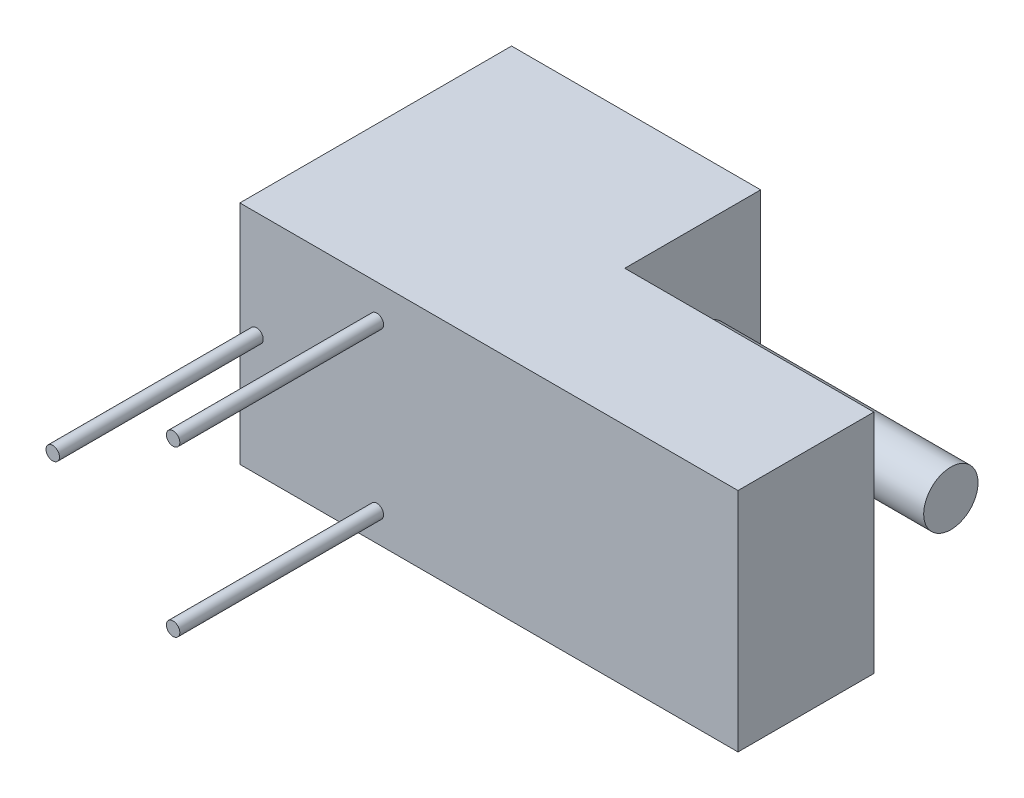
ISO-10303-21;
HEADER;
FILE_DESCRIPTION(('STEP AP214'),'2;1');
FILE_NAME('part.step','',(''),(''),'','','');
FILE_SCHEMA(('AUTOMOTIVE_DESIGN { 1 0 10303 214 1 1 1 1 }'));
ENDSEC;
DATA;
#1=APPLICATION_CONTEXT('core data for automotive mechanical design processes');
#2=APPLICATION_PROTOCOL_DEFINITION('international standard','automotive_design',2000,#1);
#3=PRODUCT_CONTEXT('',#1,'mechanical');
#4=PRODUCT('Part','Part','',(#3));
#5=PRODUCT_RELATED_PRODUCT_CATEGORY('part','',(#4));
#6=PRODUCT_DEFINITION_FORMATION('','',#4);
#7=PRODUCT_DEFINITION_CONTEXT('part definition',#1,'design');
#8=PRODUCT_DEFINITION('design','',#6,#7);
#9=PRODUCT_DEFINITION_SHAPE('','',#8);
#10=(LENGTH_UNIT() NAMED_UNIT(*) SI_UNIT(.MILLI.,.METRE.));
#11=(NAMED_UNIT(*) PLANE_ANGLE_UNIT() SI_UNIT($,.RADIAN.));
#12=(NAMED_UNIT(*) SI_UNIT($,.STERADIAN.) SOLID_ANGLE_UNIT());
#13=UNCERTAINTY_MEASURE_WITH_UNIT(LENGTH_MEASURE(1.E-05),#10,'distance_accuracy_value','');
#14=(GEOMETRIC_REPRESENTATION_CONTEXT(3) GLOBAL_UNCERTAINTY_ASSIGNED_CONTEXT((#13)) GLOBAL_UNIT_ASSIGNED_CONTEXT((#10,
#11,#12)) REPRESENTATION_CONTEXT('',''));
#15=CARTESIAN_POINT('',(0.,0.,0.));
#16=DIRECTION('',(0.,0.,1.));
#17=DIRECTION('',(1.,0.,0.));
#18=AXIS2_PLACEMENT_3D('',#15,#16,#17);
#19=CARTESIAN_POINT('',(-5.50000000000001,-2.5,6.));
#20=DIRECTION('',(0.,0.,1.));
#21=DIRECTION('',(1.,0.,0.));
#22=AXIS2_PLACEMENT_3D('',#19,#20,#21);
#23=PLANE('',#22);
#24=CARTESIAN_POINT('',(-2.47416944841838,1.757272293753,6.));
#25=DIRECTION('',(0.,0.,1.));
#26=DIRECTION('',(1.,0.,0.));
#27=AXIS2_PLACEMENT_3D('',#24,#25,#26);
#28=CIRCLE('',#27,0.148625019869675);
#29=CARTESIAN_POINT('',(-2.3255444285487,1.757272293753,6.));
#30=VERTEX_POINT('',#29);
#31=EDGE_CURVE('E147',#30,#30,#28,.T.);
#32=ORIENTED_EDGE('',*,*,#31,.F.);
#33=EDGE_LOOP('',(#32));
#34=FACE_BOUND('',#33,.T.);
#35=DIRECTION('',(0.,-1.,0.));
#36=VECTOR('',#35,1.);
#37=CARTESIAN_POINT('',(-5.49999999999998,2.5,6.));
#38=LINE('',#37,#36);
#39=CARTESIAN_POINT('',(-5.49999999999998,2.5,6.));
#40=VERTEX_POINT('',#39);
#41=CARTESIAN_POINT('',(-5.50000000000001,-2.5,6.));
#42=VERTEX_POINT('',#41);
#43=EDGE_CURVE('E122',#40,#42,#38,.T.);
#44=ORIENTED_EDGE('',*,*,#43,.T.);
#45=DIRECTION('',(1.,0.,0.));
#46=VECTOR('',#45,1.);
#47=CARTESIAN_POINT('',(-5.50000000000001,-2.5,6.));
#48=LINE('',#47,#46);
#49=CARTESIAN_POINT('',(5.5,-2.5,6.));
#50=VERTEX_POINT('',#49);
#51=EDGE_CURVE('E120',#42,#50,#48,.T.);
#52=ORIENTED_EDGE('',*,*,#51,.T.);
#53=DIRECTION('',(0.,1.,0.));
#54=VECTOR('',#53,1.);
#55=CARTESIAN_POINT('',(5.5,2.5,6.));
#56=LINE('',#55,#54);
#57=CARTESIAN_POINT('',(5.5,2.5,6.));
#58=VERTEX_POINT('',#57);
#59=EDGE_CURVE('E118',#50,#58,#56,.T.);
#60=ORIENTED_EDGE('',*,*,#59,.T.);
#61=DIRECTION('',(-1.,0.,0.));
#62=VECTOR('',#61,1.);
#63=CARTESIAN_POINT('',(-5.49999999999998,2.5,6.));
#64=LINE('',#63,#62);
#65=EDGE_CURVE('E54',#58,#40,#64,.T.);
#66=ORIENTED_EDGE('',*,*,#65,.T.);
#67=EDGE_LOOP('',(#44,#52,#60,#66));
#68=FACE_BOUND('',#67,.T.);
#69=CARTESIAN_POINT('',(-5.13193450961692,0.148625019869675,6.));
#70=DIRECTION('',(0.,0.,1.));
#71=DIRECTION('',(1.,0.,0.));
#72=AXIS2_PLACEMENT_3D('',#69,#70,#71);
#73=CIRCLE('',#72,0.148625019869675);
#74=CARTESIAN_POINT('',(-4.98330948974724,0.148625019869675,6.));
#75=VERTEX_POINT('',#74);
#76=EDGE_CURVE('E141',#75,#75,#73,.T.);
#77=ORIENTED_EDGE('',*,*,#76,.F.);
#78=EDGE_LOOP('',(#77));
#79=FACE_BOUND('',#78,.T.);
#80=CARTESIAN_POINT('',(-2.47416944841838,-1.87966936893974,6.));
#81=DIRECTION('',(0.,0.,1.));
#82=DIRECTION('',(1.,0.,0.));
#83=AXIS2_PLACEMENT_3D('',#80,#81,#82);
#84=CIRCLE('',#83,0.148625019869675);
#85=CARTESIAN_POINT('',(-2.3255444285487,-1.87966936893974,6.));
#86=VERTEX_POINT('',#85);
#87=EDGE_CURVE('E153',#86,#86,#84,.T.);
#88=ORIENTED_EDGE('',*,*,#87,.F.);
#89=EDGE_LOOP('',(#88));
#90=FACE_BOUND('',#89,.T.);
#91=ADVANCED_FACE('F31',(#34,#68,#79,#90),#23,.T.);
#92=CARTESIAN_POINT('',(0.,2.5,3.));
#93=DIRECTION('',(-1.,0.,0.));
#94=DIRECTION('',(0.,-1.,0.));
#95=AXIS2_PLACEMENT_3D('',#92,#93,#94);
#96=PLANE('',#95);
#97=DIRECTION('',(0.,0.,1.));
#98=VECTOR('',#97,1.);
#99=CARTESIAN_POINT('',(0.,-2.5,6.));
#100=LINE('',#99,#98);
#101=CARTESIAN_POINT('',(0.,-2.5,0.));
#102=VERTEX_POINT('',#101);
#103=CARTESIAN_POINT('',(0.,-2.5,3.));
#104=VERTEX_POINT('',#103);
#105=EDGE_CURVE('E46',#102,#104,#100,.T.);
#106=ORIENTED_EDGE('',*,*,#105,.F.);
#107=DIRECTION('',(0.,-1.,0.));
#108=VECTOR('',#107,1.);
#109=CARTESIAN_POINT('',(0.,-2.5,0.));
#110=LINE('',#109,#108);
#111=CARTESIAN_POINT('',(0.,2.5,0.));
#112=VERTEX_POINT('',#111);
#113=EDGE_CURVE('E89',#112,#102,#110,.T.);
#114=ORIENTED_EDGE('',*,*,#113,.F.);
#115=DIRECTION('',(0.,0.,-1.));
#116=VECTOR('',#115,1.);
#117=CARTESIAN_POINT('',(0.,2.5,3.));
#118=LINE('',#117,#116);
#119=CARTESIAN_POINT('',(0.,2.5,3.));
#120=VERTEX_POINT('',#119);
#121=EDGE_CURVE('E84',#120,#112,#118,.T.);
#122=ORIENTED_EDGE('',*,*,#121,.F.);
#123=DIRECTION('',(0.,-1.,0.));
#124=VECTOR('',#123,1.);
#125=CARTESIAN_POINT('',(0.,2.5,3.));
#126=LINE('',#125,#124);
#127=EDGE_CURVE('E88',#120,#104,#126,.T.);
#128=ORIENTED_EDGE('',*,*,#127,.T.);
#129=EDGE_LOOP('',(#106,#114,#122,#128));
#130=FACE_BOUND('',#129,.T.);
#131=CARTESIAN_POINT('',(0.,0.,1.3));
#132=DIRECTION('',(-1.,0.,0.));
#133=DIRECTION('',(0.,-1.,0.));
#134=AXIS2_PLACEMENT_3D('',#131,#132,#133);
#135=CIRCLE('',#134,0.6);
#136=CARTESIAN_POINT('',(0.,-0.6,1.3));
#137=VERTEX_POINT('',#136);
#138=EDGE_CURVE('E11',#137,#137,#135,.F.);
#139=ORIENTED_EDGE('',*,*,#138,.F.);
#140=EDGE_LOOP('',(#139));
#141=FACE_BOUND('',#140,.T.);
#142=ADVANCED_FACE('F86',(#130,#141),#96,.F.);
#143=CARTESIAN_POINT('',(-5.49999999999998,2.5,6.));
#144=DIRECTION('',(1.,0.,0.));
#145=DIRECTION('',(0.,1.,0.));
#146=AXIS2_PLACEMENT_3D('',#143,#144,#145);
#147=PLANE('',#146);
#148=DIRECTION('',(0.,-1.,0.));
#149=VECTOR('',#148,1.);
#150=CARTESIAN_POINT('',(-5.49999999999998,2.5,0.));
#151=LINE('',#150,#149);
#152=CARTESIAN_POINT('',(-5.49999999999998,2.5,0.));
#153=VERTEX_POINT('',#152);
#154=CARTESIAN_POINT('',(-5.50000000000001,-2.5,0.));
#155=VERTEX_POINT('',#154);
#156=EDGE_CURVE('E129',#153,#155,#151,.T.);
#157=ORIENTED_EDGE('',*,*,#156,.T.);
#158=DIRECTION('',(0.,0.,-1.));
#159=VECTOR('',#158,1.);
#160=CARTESIAN_POINT('',(-5.50000000000001,-2.5,6.));
#161=LINE('',#160,#159);
#162=EDGE_CURVE('E105',#42,#155,#161,.T.);
#163=ORIENTED_EDGE('',*,*,#162,.F.);
#164=ORIENTED_EDGE('',*,*,#43,.F.);
#165=DIRECTION('',(0.,0.,-1.));
#166=VECTOR('',#165,1.);
#167=CARTESIAN_POINT('',(-5.49999999999998,2.5,6.));
#168=LINE('',#167,#166);
#169=EDGE_CURVE('E114',#40,#153,#168,.T.);
#170=ORIENTED_EDGE('',*,*,#169,.T.);
#171=EDGE_LOOP('',(#157,#163,#164,#170));
#172=FACE_BOUND('',#171,.T.);
#173=ADVANCED_FACE('F33',(#172),#147,.F.);
#174=CARTESIAN_POINT('',(-5.50000000000001,-2.5,6.));
#175=DIRECTION('',(0.,1.,0.));
#176=DIRECTION('',(-1.,0.,0.));
#177=AXIS2_PLACEMENT_3D('',#174,#175,#176);
#178=PLANE('',#177);
#179=ORIENTED_EDGE('',*,*,#105,.T.);
#180=DIRECTION('',(1.,0.,0.));
#181=VECTOR('',#180,1.);
#182=CARTESIAN_POINT('',(-5.50000000000001,-2.5,3.));
#183=LINE('',#182,#181);
#184=CARTESIAN_POINT('',(5.5,-2.5,3.));
#185=VERTEX_POINT('',#184);
#186=EDGE_CURVE('E98',#104,#185,#183,.T.);
#187=ORIENTED_EDGE('',*,*,#186,.T.);
#188=DIRECTION('',(0.,0.,-1.));
#189=VECTOR('',#188,1.);
#190=CARTESIAN_POINT('',(5.5,-2.5,6.));
#191=LINE('',#190,#189);
#192=EDGE_CURVE('E110',#50,#185,#191,.T.);
#193=ORIENTED_EDGE('',*,*,#192,.F.);
#194=ORIENTED_EDGE('',*,*,#51,.F.);
#195=ORIENTED_EDGE('',*,*,#162,.T.);
#196=DIRECTION('',(1.,0.,0.));
#197=VECTOR('',#196,1.);
#198=CARTESIAN_POINT('',(-5.50000000000001,-2.5,0.));
#199=LINE('',#198,#197);
#200=EDGE_CURVE('E126',#155,#102,#199,.T.);
#201=ORIENTED_EDGE('',*,*,#200,.T.);
#202=EDGE_LOOP('',(#179,#187,#193,#194,#195,#201));
#203=FACE_BOUND('',#202,.T.);
#204=ADVANCED_FACE('F177',(#203),#178,.F.);
#205=CARTESIAN_POINT('',(5.5,2.5,6.));
#206=DIRECTION('',(-1.,0.,0.));
#207=DIRECTION('',(0.,0.,1.));
#208=AXIS2_PLACEMENT_3D('',#205,#206,#207);
#209=PLANE('',#208);
#210=ORIENTED_EDGE('',*,*,#192,.T.);
#211=DIRECTION('',(0.,1.,0.));
#212=VECTOR('',#211,1.);
#213=CARTESIAN_POINT('',(5.5,2.5,3.));
#214=LINE('',#213,#212);
#215=CARTESIAN_POINT('',(5.5,2.5,3.));
#216=VERTEX_POINT('',#215);
#217=EDGE_CURVE('E133',#185,#216,#214,.T.);
#218=ORIENTED_EDGE('',*,*,#217,.T.);
#219=DIRECTION('',(0.,0.,-1.));
#220=VECTOR('',#219,1.);
#221=CARTESIAN_POINT('',(5.5,2.5,6.));
#222=LINE('',#221,#220);
#223=EDGE_CURVE('E104',#58,#216,#222,.T.);
#224=ORIENTED_EDGE('',*,*,#223,.F.);
#225=ORIENTED_EDGE('',*,*,#59,.F.);
#226=EDGE_LOOP('',(#210,#218,#224,#225));
#227=FACE_BOUND('',#226,.T.);
#228=ADVANCED_FACE('F175',(#227),#209,.F.);
#229=CARTESIAN_POINT('',(-5.49999999999998,2.5,6.));
#230=DIRECTION('',(0.,-1.,0.));
#231=DIRECTION('',(1.,0.,0.));
#232=AXIS2_PLACEMENT_3D('',#229,#230,#231);
#233=PLANE('',#232);
#234=ORIENTED_EDGE('',*,*,#223,.T.);
#235=DIRECTION('',(-1.,0.,0.));
#236=VECTOR('',#235,1.);
#237=CARTESIAN_POINT('',(-5.49999999999998,2.5,3.));
#238=LINE('',#237,#236);
#239=EDGE_CURVE('E39',#216,#120,#238,.T.);
#240=ORIENTED_EDGE('',*,*,#239,.T.);
#241=ORIENTED_EDGE('',*,*,#121,.T.);
#242=DIRECTION('',(-1.,0.,0.));
#243=VECTOR('',#242,1.);
#244=CARTESIAN_POINT('',(-5.49999999999998,2.5,0.));
#245=LINE('',#244,#243);
#246=EDGE_CURVE('E124',#112,#153,#245,.T.);
#247=ORIENTED_EDGE('',*,*,#246,.T.);
#248=ORIENTED_EDGE('',*,*,#169,.F.);
#249=ORIENTED_EDGE('',*,*,#65,.F.);
#250=EDGE_LOOP('',(#234,#240,#241,#247,#248,#249));
#251=FACE_BOUND('',#250,.T.);
#252=ADVANCED_FACE('F102',(#251),#233,.F.);
#253=CARTESIAN_POINT('',(-5.50000000000001,-2.5,0.));
#254=DIRECTION('',(0.,0.,1.));
#255=DIRECTION('',(1.,0.,0.));
#256=AXIS2_PLACEMENT_3D('',#253,#254,#255);
#257=PLANE('',#256);
#258=ORIENTED_EDGE('',*,*,#246,.F.);
#259=ORIENTED_EDGE('',*,*,#113,.T.);
#260=ORIENTED_EDGE('',*,*,#200,.F.);
#261=ORIENTED_EDGE('',*,*,#156,.F.);
#262=EDGE_LOOP('',(#258,#259,#260,#261));
#263=FACE_BOUND('',#262,.T.);
#264=ADVANCED_FACE('F171',(#263),#257,.F.);
#265=CARTESIAN_POINT('',(7.68478779208393,2.5,3.));
#266=DIRECTION('',(0.,0.,1.));
#267=DIRECTION('',(1.,0.,0.));
#268=AXIS2_PLACEMENT_3D('',#265,#266,#267);
#269=PLANE('',#268);
#270=ORIENTED_EDGE('',*,*,#186,.F.);
#271=ORIENTED_EDGE('',*,*,#127,.F.);
#272=ORIENTED_EDGE('',*,*,#239,.F.);
#273=ORIENTED_EDGE('',*,*,#217,.F.);
#274=EDGE_LOOP('',(#270,#271,#272,#273));
#275=FACE_BOUND('',#274,.T.);
#276=ADVANCED_FACE('F95',(#275),#269,.F.);
#277=CARTESIAN_POINT('',(7.19705627484771,0.,1.3));
#278=DIRECTION('',(-1.,0.,0.));
#279=DIRECTION('',(0.,-1.,0.));
#280=AXIS2_PLACEMENT_3D('',#277,#278,#279);
#281=CYLINDRICAL_SURFACE('',#280,0.6);
#282=CARTESIAN_POINT('',(5.5,0.,1.3));
#283=DIRECTION('',(-1.,0.,0.));
#284=DIRECTION('',(0.,0.,1.));
#285=AXIS2_PLACEMENT_3D('',#282,#283,#284);
#286=CIRCLE('',#285,0.6);
#287=CARTESIAN_POINT('',(5.5,0.,1.9));
#288=VERTEX_POINT('',#287);
#289=EDGE_CURVE('E99',#288,#288,#286,.T.);
#290=ORIENTED_EDGE('',*,*,#289,.T.);
#291=EDGE_LOOP('',(#290));
#292=FACE_BOUND('',#291,.T.);
#293=ORIENTED_EDGE('',*,*,#138,.T.);
#294=EDGE_LOOP('',(#293));
#295=FACE_BOUND('',#294,.T.);
#296=ADVANCED_FACE('F205',(#292,#295),#281,.T.);
#297=CARTESIAN_POINT('',(5.5,2.5,6.));
#298=DIRECTION('',(-1.,0.,0.));
#299=DIRECTION('',(0.,0.,1.));
#300=AXIS2_PLACEMENT_3D('',#297,#298,#299);
#301=PLANE('',#300);
#302=ORIENTED_EDGE('',*,*,#289,.F.);
#303=EDGE_LOOP('',(#302));
#304=FACE_BOUND('',#303,.T.);
#305=ADVANCED_FACE('F196',(#304),#301,.F.);
#306=CARTESIAN_POINT('',(-5.13193450961692,0.148625019869675,10.5));
#307=DIRECTION('',(0.,0.,-1.));
#308=DIRECTION('',(-1.,0.,0.));
#309=AXIS2_PLACEMENT_3D('',#306,#307,#308);
#310=CYLINDRICAL_SURFACE('',#309,0.148625019869675);
#311=CARTESIAN_POINT('',(-5.13193450961692,0.148625019869675,10.5));
#312=DIRECTION('',(0.,0.,1.));
#313=DIRECTION('',(1.,0.,0.));
#314=AXIS2_PLACEMENT_3D('',#311,#312,#313);
#315=CIRCLE('',#314,0.148625019869675);
#316=CARTESIAN_POINT('',(-4.98330948974724,0.148625019869675,10.5));
#317=VERTEX_POINT('',#316);
#318=EDGE_CURVE('E138',#317,#317,#315,.T.);
#319=ORIENTED_EDGE('',*,*,#318,.F.);
#320=EDGE_LOOP('',(#319));
#321=FACE_BOUND('',#320,.T.);
#322=ORIENTED_EDGE('',*,*,#76,.T.);
#323=EDGE_LOOP('',(#322));
#324=FACE_BOUND('',#323,.T.);
#325=ADVANCED_FACE('F194',(#321,#324),#310,.T.);
#326=CARTESIAN_POINT('',(-5.13193450961692,0.148625019869675,10.5));
#327=DIRECTION('',(0.,0.,1.));
#328=DIRECTION('',(1.,0.,0.));
#329=AXIS2_PLACEMENT_3D('',#326,#327,#328);
#330=PLANE('',#329);
#331=ORIENTED_EDGE('',*,*,#318,.T.);
#332=EDGE_LOOP('',(#331));
#333=FACE_BOUND('',#332,.T.);
#334=ADVANCED_FACE('F195',(#333),#330,.T.);
#335=CARTESIAN_POINT('',(-2.47416944841838,1.757272293753,10.5));
#336=DIRECTION('',(0.,0.,-1.));
#337=DIRECTION('',(-1.,0.,0.));
#338=AXIS2_PLACEMENT_3D('',#335,#336,#337);
#339=CYLINDRICAL_SURFACE('',#338,0.148625019869675);
#340=CARTESIAN_POINT('',(-2.47416944841838,1.757272293753,10.5));
#341=DIRECTION('',(0.,0.,1.));
#342=DIRECTION('',(1.,0.,0.));
#343=AXIS2_PLACEMENT_3D('',#340,#341,#342);
#344=CIRCLE('',#343,0.148625019869675);
#345=CARTESIAN_POINT('',(-2.3255444285487,1.757272293753,10.5));
#346=VERTEX_POINT('',#345);
#347=EDGE_CURVE('E144',#346,#346,#344,.T.);
#348=ORIENTED_EDGE('',*,*,#347,.F.);
#349=EDGE_LOOP('',(#348));
#350=FACE_BOUND('',#349,.T.);
#351=ORIENTED_EDGE('',*,*,#31,.T.);
#352=EDGE_LOOP('',(#351));
#353=FACE_BOUND('',#352,.T.);
#354=ADVANCED_FACE('F202',(#350,#353),#339,.T.);
#355=CARTESIAN_POINT('',(-2.47416944841838,1.757272293753,10.5));
#356=DIRECTION('',(0.,0.,1.));
#357=DIRECTION('',(1.,0.,0.));
#358=AXIS2_PLACEMENT_3D('',#355,#356,#357);
#359=PLANE('',#358);
#360=ORIENTED_EDGE('',*,*,#347,.T.);
#361=EDGE_LOOP('',(#360));
#362=FACE_BOUND('',#361,.T.);
#363=ADVANCED_FACE('F262',(#362),#359,.T.);
#364=CARTESIAN_POINT('',(-2.47416944841838,-1.87966936893974,10.5));
#365=DIRECTION('',(0.,0.,-1.));
#366=DIRECTION('',(-1.,0.,0.));
#367=AXIS2_PLACEMENT_3D('',#364,#365,#366);
#368=CYLINDRICAL_SURFACE('',#367,0.148625019869675);
#369=CARTESIAN_POINT('',(-2.47416944841838,-1.87966936893974,10.5));
#370=DIRECTION('',(0.,0.,1.));
#371=DIRECTION('',(1.,0.,0.));
#372=AXIS2_PLACEMENT_3D('',#369,#370,#371);
#373=CIRCLE('',#372,0.148625019869675);
#374=CARTESIAN_POINT('',(-2.3255444285487,-1.87966936893974,10.5));
#375=VERTEX_POINT('',#374);
#376=EDGE_CURVE('E150',#375,#375,#373,.T.);
#377=ORIENTED_EDGE('',*,*,#376,.F.);
#378=EDGE_LOOP('',(#377));
#379=FACE_BOUND('',#378,.T.);
#380=ORIENTED_EDGE('',*,*,#87,.T.);
#381=EDGE_LOOP('',(#380));
#382=FACE_BOUND('',#381,.T.);
#383=ADVANCED_FACE('F157',(#379,#382),#368,.T.);
#384=CARTESIAN_POINT('',(-2.47416944841838,-1.87966936893974,10.5));
#385=DIRECTION('',(0.,0.,1.));
#386=DIRECTION('',(1.,0.,0.));
#387=AXIS2_PLACEMENT_3D('',#384,#385,#386);
#388=PLANE('',#387);
#389=ORIENTED_EDGE('',*,*,#376,.T.);
#390=EDGE_LOOP('',(#389));
#391=FACE_BOUND('',#390,.T.);
#392=ADVANCED_FACE('F276',(#391),#388,.T.);
#393=CLOSED_SHELL('',(#91,#142,#173,#204,#228,#252,#264,#276,#296,#305,#325,#334,#354,#363,#383,#392));
#394=MANIFOLD_SOLID_BREP('B2',#393);
#395=ADVANCED_BREP_SHAPE_REPRESENTATION('',(#18,#394),#14);
#396=SHAPE_DEFINITION_REPRESENTATION(#9,#395);
ENDSEC;
END-ISO-10303-21;
